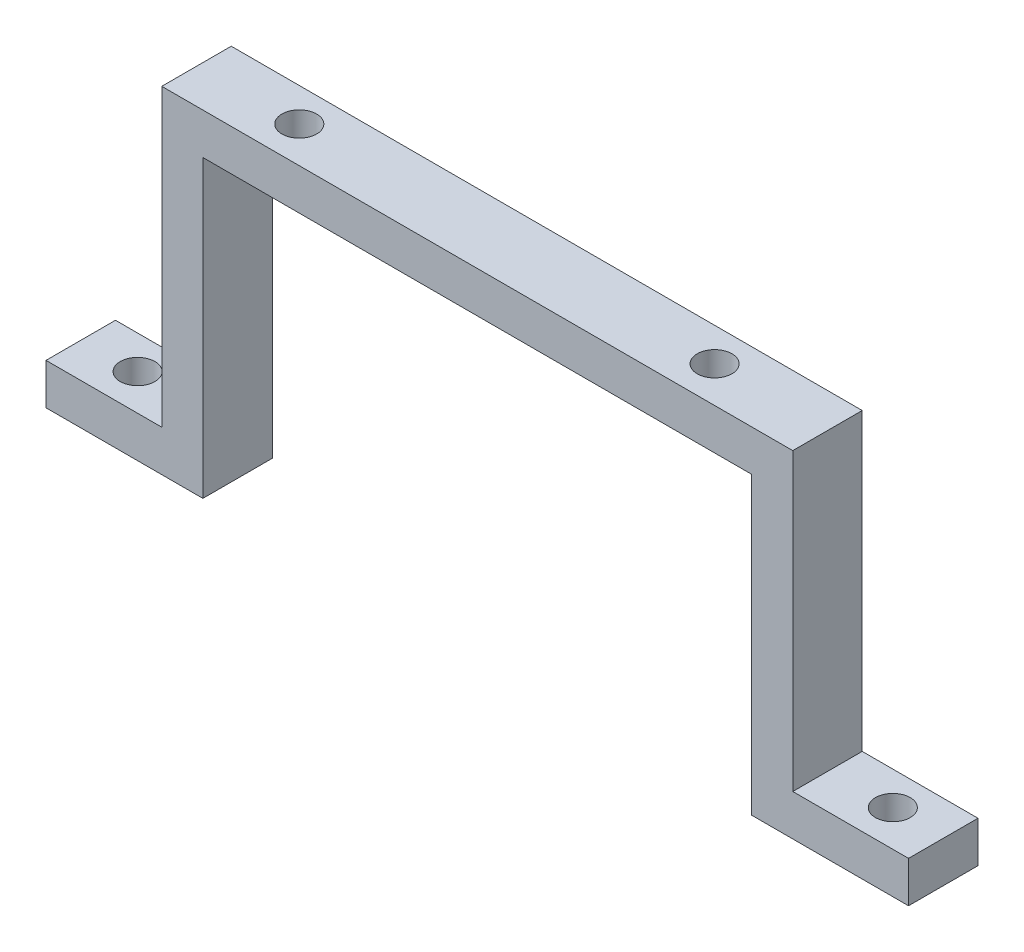
ISO-10303-21;
HEADER;
FILE_DESCRIPTION(('STEP AP214'),'2;1');
FILE_NAME('part.step','',(''),(''),'','','');
FILE_SCHEMA(('AUTOMOTIVE_DESIGN { 1 0 10303 214 1 1 1 1 }'));
ENDSEC;
DATA;
#1=APPLICATION_CONTEXT('core data for automotive mechanical design processes');
#2=APPLICATION_PROTOCOL_DEFINITION('international standard','automotive_design',2000,#1);
#3=PRODUCT_CONTEXT('',#1,'mechanical');
#4=PRODUCT('Part','Part','',(#3));
#5=PRODUCT_RELATED_PRODUCT_CATEGORY('part','',(#4));
#6=PRODUCT_DEFINITION_FORMATION('','',#4);
#7=PRODUCT_DEFINITION_CONTEXT('part definition',#1,'design');
#8=PRODUCT_DEFINITION('design','',#6,#7);
#9=PRODUCT_DEFINITION_SHAPE('','',#8);
#10=(LENGTH_UNIT() NAMED_UNIT(*) SI_UNIT(.MILLI.,.METRE.));
#11=(NAMED_UNIT(*) PLANE_ANGLE_UNIT() SI_UNIT($,.RADIAN.));
#12=(NAMED_UNIT(*) SI_UNIT($,.STERADIAN.) SOLID_ANGLE_UNIT());
#13=UNCERTAINTY_MEASURE_WITH_UNIT(LENGTH_MEASURE(1.E-05),#10,'distance_accuracy_value','');
#14=(GEOMETRIC_REPRESENTATION_CONTEXT(3) GLOBAL_UNCERTAINTY_ASSIGNED_CONTEXT((#13)) GLOBAL_UNIT_ASSIGNED_CONTEXT((#10,
#11,#12)) REPRESENTATION_CONTEXT('',''));
#15=CARTESIAN_POINT('',(0.,0.,0.));
#16=DIRECTION('',(0.,0.,1.));
#17=DIRECTION('',(1.,0.,0.));
#18=AXIS2_PLACEMENT_3D('',#15,#16,#17);
#19=CARTESIAN_POINT('',(52.0672999658622,-3.55008003057952,6.));
#20=DIRECTION('',(0.,1.,0.));
#21=DIRECTION('',(-1.,0.,0.));
#22=AXIS2_PLACEMENT_3D('',#19,#20,#21);
#23=PLANE('',#22);
#24=CARTESIAN_POINT('',(57.5916408370889,-3.55008003057952,2.8809648636639));
#25=DIRECTION('',(0.,1.,0.));
#26=DIRECTION('',(-1.,0.,0.));
#27=AXIS2_PLACEMENT_3D('',#24,#25,#26);
#28=CIRCLE('',#27,1.5);
#29=CARTESIAN_POINT('',(56.0916408370889,-3.55008003057952,2.8809648636639));
#30=VERTEX_POINT('',#29);
#31=EDGE_CURVE('E165',#30,#30,#28,.F.);
#32=ORIENTED_EDGE('',*,*,#31,.F.);
#33=EDGE_LOOP('',(#32));
#34=FACE_BOUND('',#33,.T.);
#35=DIRECTION('',(1.,0.,0.));
#36=VECTOR('',#35,1.);
#37=CARTESIAN_POINT('',(52.0672999658622,-3.55008003057952,0.));
#38=LINE('',#37,#36);
#39=CARTESIAN_POINT('',(48.5172199352827,-3.55008003057952,0.));
#40=VERTEX_POINT('',#39);
#41=CARTESIAN_POINT('',(62.0672999658622,-3.55008003057952,0.));
#42=VERTEX_POINT('',#41);
#43=EDGE_CURVE('E161',#40,#42,#38,.T.);
#44=ORIENTED_EDGE('',*,*,#43,.T.);
#45=DIRECTION('',(0.,0.,-1.));
#46=VECTOR('',#45,1.);
#47=CARTESIAN_POINT('',(62.0672999658622,-3.55008003057952,6.));
#48=LINE('',#47,#46);
#49=CARTESIAN_POINT('',(62.0672999658622,-3.55008003057952,6.));
#50=VERTEX_POINT('',#49);
#51=EDGE_CURVE('E11',#50,#42,#48,.T.);
#52=ORIENTED_EDGE('',*,*,#51,.F.);
#53=DIRECTION('',(1.,0.,0.));
#54=VECTOR('',#53,1.);
#55=CARTESIAN_POINT('',(52.0672999658622,-3.55008003057952,6.));
#56=LINE('',#55,#54);
#57=CARTESIAN_POINT('',(48.5172199352827,-3.55008003057952,6.));
#58=VERTEX_POINT('',#57);
#59=EDGE_CURVE('E109',#58,#50,#56,.T.);
#60=ORIENTED_EDGE('',*,*,#59,.F.);
#61=DIRECTION('',(0.,0.,-1.));
#62=VECTOR('',#61,1.);
#63=CARTESIAN_POINT('',(48.5172199352827,-3.55008003057952,6.));
#64=LINE('',#63,#62);
#65=EDGE_CURVE('E157',#58,#40,#64,.T.);
#66=ORIENTED_EDGE('',*,*,#65,.T.);
#67=EDGE_LOOP('',(#44,#52,#60,#66));
#68=FACE_BOUND('',#67,.T.);
#69=ADVANCED_FACE('F39',(#34,#68),#23,.F.);
#70=CARTESIAN_POINT('',(62.0672999658622,0.,6.));
#71=DIRECTION('',(1.,0.,0.));
#72=DIRECTION('',(0.,0.,-1.));
#73=AXIS2_PLACEMENT_3D('',#70,#71,#72);
#74=PLANE('',#73);
#75=DIRECTION('',(0.,-1.,0.));
#76=VECTOR('',#75,1.);
#77=CARTESIAN_POINT('',(62.0672999658622,0.,0.));
#78=LINE('',#77,#76);
#79=CARTESIAN_POINT('',(62.0672999658622,0.,0.));
#80=VERTEX_POINT('',#79);
#81=EDGE_CURVE('E164',#80,#42,#78,.T.);
#82=ORIENTED_EDGE('',*,*,#81,.F.);
#83=DIRECTION('',(0.,0.,-1.));
#84=VECTOR('',#83,1.);
#85=CARTESIAN_POINT('',(62.0672999658622,0.,6.));
#86=LINE('',#85,#84);
#87=CARTESIAN_POINT('',(62.0672999658622,0.,6.));
#88=VERTEX_POINT('',#87);
#89=EDGE_CURVE('E48',#88,#80,#86,.T.);
#90=ORIENTED_EDGE('',*,*,#89,.F.);
#91=DIRECTION('',(0.,-1.,0.));
#92=VECTOR('',#91,1.);
#93=CARTESIAN_POINT('',(62.0672999658622,0.,6.));
#94=LINE('',#93,#92);
#95=EDGE_CURVE('E230',#88,#50,#94,.T.);
#96=ORIENTED_EDGE('',*,*,#95,.T.);
#97=ORIENTED_EDGE('',*,*,#51,.T.);
#98=EDGE_LOOP('',(#82,#90,#96,#97));
#99=FACE_BOUND('',#98,.T.);
#100=ADVANCED_FACE('F278',(#99),#74,.T.);
#101=CARTESIAN_POINT('',(52.0672999658622,0.,6.));
#102=DIRECTION('',(0.,1.,0.));
#103=DIRECTION('',(-1.,0.,0.));
#104=AXIS2_PLACEMENT_3D('',#101,#102,#103);
#105=PLANE('',#104);
#106=CARTESIAN_POINT('',(57.5916408370889,0.,2.8809648636639));
#107=DIRECTION('',(0.,1.,0.));
#108=DIRECTION('',(-1.,0.,0.));
#109=AXIS2_PLACEMENT_3D('',#106,#107,#108);
#110=CIRCLE('',#109,1.5);
#111=CARTESIAN_POINT('',(56.0916408370889,0.,2.8809648636639));
#112=VERTEX_POINT('',#111);
#113=EDGE_CURVE('E42',#112,#112,#110,.F.);
#114=ORIENTED_EDGE('',*,*,#113,.T.);
#115=EDGE_LOOP('',(#114));
#116=FACE_BOUND('',#115,.T.);
#117=DIRECTION('',(1.,0.,0.));
#118=VECTOR('',#117,1.);
#119=CARTESIAN_POINT('',(52.0672999658622,0.,0.));
#120=LINE('',#119,#118);
#121=CARTESIAN_POINT('',(52.0672999658622,0.,0.));
#122=VERTEX_POINT('',#121);
#123=EDGE_CURVE('E168',#122,#80,#120,.T.);
#124=ORIENTED_EDGE('',*,*,#123,.F.);
#125=DIRECTION('',(0.,0.,-1.));
#126=VECTOR('',#125,1.);
#127=CARTESIAN_POINT('',(52.0672999658622,0.,6.));
#128=LINE('',#127,#126);
#129=CARTESIAN_POINT('',(52.0672999658622,0.,6.));
#130=VERTEX_POINT('',#129);
#131=EDGE_CURVE('E204',#130,#122,#128,.T.);
#132=ORIENTED_EDGE('',*,*,#131,.F.);
#133=DIRECTION('',(1.,0.,0.));
#134=VECTOR('',#133,1.);
#135=CARTESIAN_POINT('',(52.0672999658622,0.,6.));
#136=LINE('',#135,#134);
#137=EDGE_CURVE('E233',#130,#88,#136,.T.);
#138=ORIENTED_EDGE('',*,*,#137,.T.);
#139=ORIENTED_EDGE('',*,*,#89,.T.);
#140=EDGE_LOOP('',(#124,#132,#138,#139));
#141=FACE_BOUND('',#140,.T.);
#142=ADVANCED_FACE('F285',(#116,#141),#105,.T.);
#143=CARTESIAN_POINT('',(52.0672999658622,25.5,6.));
#144=DIRECTION('',(1.,0.,0.));
#145=DIRECTION('',(0.,0.,-1.));
#146=AXIS2_PLACEMENT_3D('',#143,#144,#145);
#147=PLANE('',#146);
#148=DIRECTION('',(0.,-1.,0.));
#149=VECTOR('',#148,1.);
#150=CARTESIAN_POINT('',(52.0672999658622,25.5,0.));
#151=LINE('',#150,#149);
#152=CARTESIAN_POINT('',(52.0672999658622,25.5,0.));
#153=VERTEX_POINT('',#152);
#154=EDGE_CURVE('E171',#153,#122,#151,.T.);
#155=ORIENTED_EDGE('',*,*,#154,.F.);
#156=DIRECTION('',(0.,0.,-1.));
#157=VECTOR('',#156,1.);
#158=CARTESIAN_POINT('',(52.0672999658622,25.5,6.));
#159=LINE('',#158,#157);
#160=CARTESIAN_POINT('',(52.0672999658622,25.5,6.));
#161=VERTEX_POINT('',#160);
#162=EDGE_CURVE('E202',#161,#153,#159,.T.);
#163=ORIENTED_EDGE('',*,*,#162,.F.);
#164=DIRECTION('',(0.,-1.,0.));
#165=VECTOR('',#164,1.);
#166=CARTESIAN_POINT('',(52.0672999658622,25.5,6.));
#167=LINE('',#166,#165);
#168=EDGE_CURVE('E236',#161,#130,#167,.T.);
#169=ORIENTED_EDGE('',*,*,#168,.T.);
#170=ORIENTED_EDGE('',*,*,#131,.T.);
#171=EDGE_LOOP('',(#155,#163,#169,#170));
#172=FACE_BOUND('',#171,.T.);
#173=ADVANCED_FACE('F296',(#172),#147,.T.);
#174=CARTESIAN_POINT('',(-2.43270003413782,25.5,6.));
#175=DIRECTION('',(0.,1.,0.));
#176=DIRECTION('',(0.,0.,1.));
#177=AXIS2_PLACEMENT_3D('',#174,#175,#176);
#178=PLANE('',#177);
#179=CARTESIAN_POINT('',(6.32717545497642,25.5,2.8809648636639));
#180=DIRECTION('',(0.,1.,0.));
#181=DIRECTION('',(0.,0.,1.));
#182=AXIS2_PLACEMENT_3D('',#179,#180,#181);
#183=CIRCLE('',#182,1.5);
#184=CARTESIAN_POINT('',(6.32717545497642,25.5,4.3809648636639));
#185=VERTEX_POINT('',#184);
#186=EDGE_CURVE('E213',#185,#185,#183,.F.);
#187=ORIENTED_EDGE('',*,*,#186,.T.);
#188=EDGE_LOOP('',(#187));
#189=FACE_BOUND('',#188,.T.);
#190=CARTESIAN_POINT('',(42.1964298709437,25.5,2.8809648636639));
#191=DIRECTION('',(0.,1.,0.));
#192=DIRECTION('',(0.,0.,1.));
#193=AXIS2_PLACEMENT_3D('',#190,#191,#192);
#194=CIRCLE('',#193,1.5);
#195=CARTESIAN_POINT('',(42.1964298709437,25.5,4.38096486366391));
#196=VERTEX_POINT('',#195);
#197=EDGE_CURVE('E210',#196,#196,#194,.F.);
#198=ORIENTED_EDGE('',*,*,#197,.T.);
#199=EDGE_LOOP('',(#198));
#200=FACE_BOUND('',#199,.T.);
#201=DIRECTION('',(1.,0.,0.));
#202=VECTOR('',#201,1.);
#203=CARTESIAN_POINT('',(-2.43270003413782,25.5,0.));
#204=LINE('',#203,#202);
#205=CARTESIAN_POINT('',(-2.43270003413782,25.5,0.));
#206=VERTEX_POINT('',#205);
#207=EDGE_CURVE('E174',#206,#153,#204,.T.);
#208=ORIENTED_EDGE('',*,*,#207,.F.);
#209=DIRECTION('',(0.,0.,-1.));
#210=VECTOR('',#209,1.);
#211=CARTESIAN_POINT('',(-2.43270003413782,25.5,6.));
#212=LINE('',#211,#210);
#213=CARTESIAN_POINT('',(-2.43270003413782,25.5,6.));
#214=VERTEX_POINT('',#213);
#215=EDGE_CURVE('E200',#214,#206,#212,.T.);
#216=ORIENTED_EDGE('',*,*,#215,.F.);
#217=DIRECTION('',(1.,0.,0.));
#218=VECTOR('',#217,1.);
#219=CARTESIAN_POINT('',(-2.43270003413782,25.5,6.));
#220=LINE('',#219,#218);
#221=EDGE_CURVE('E239',#214,#161,#220,.T.);
#222=ORIENTED_EDGE('',*,*,#221,.T.);
#223=ORIENTED_EDGE('',*,*,#162,.T.);
#224=EDGE_LOOP('',(#208,#216,#222,#223));
#225=FACE_BOUND('',#224,.T.);
#226=ADVANCED_FACE('F299',(#189,#200,#225),#178,.T.);
#227=CARTESIAN_POINT('',(-2.43270003413782,0.,6.));
#228=DIRECTION('',(-1.,0.,0.));
#229=DIRECTION('',(0.,0.,1.));
#230=AXIS2_PLACEMENT_3D('',#227,#228,#229);
#231=PLANE('',#230);
#232=DIRECTION('',(0.,1.,0.));
#233=VECTOR('',#232,1.);
#234=CARTESIAN_POINT('',(-2.43270003413782,0.,0.));
#235=LINE('',#234,#233);
#236=CARTESIAN_POINT('',(-2.43270003413782,0.,0.));
#237=VERTEX_POINT('',#236);
#238=EDGE_CURVE('E177',#237,#206,#235,.T.);
#239=ORIENTED_EDGE('',*,*,#238,.F.);
#240=DIRECTION('',(0.,0.,-1.));
#241=VECTOR('',#240,1.);
#242=CARTESIAN_POINT('',(-2.43270003413782,0.,6.));
#243=LINE('',#242,#241);
#244=CARTESIAN_POINT('',(-2.43270003413782,0.,6.));
#245=VERTEX_POINT('',#244);
#246=EDGE_CURVE('E198',#245,#237,#243,.T.);
#247=ORIENTED_EDGE('',*,*,#246,.F.);
#248=DIRECTION('',(0.,1.,0.));
#249=VECTOR('',#248,1.);
#250=CARTESIAN_POINT('',(-2.43270003413782,0.,6.));
#251=LINE('',#250,#249);
#252=EDGE_CURVE('E242',#245,#214,#251,.T.);
#253=ORIENTED_EDGE('',*,*,#252,.T.);
#254=ORIENTED_EDGE('',*,*,#215,.T.);
#255=EDGE_LOOP('',(#239,#247,#253,#254));
#256=FACE_BOUND('',#255,.T.);
#257=ADVANCED_FACE('F301',(#256),#231,.T.);
#258=CARTESIAN_POINT('',(-12.4327000341378,0.,6.));
#259=DIRECTION('',(0.,1.,0.));
#260=DIRECTION('',(0.,0.,1.));
#261=AXIS2_PLACEMENT_3D('',#258,#259,#260);
#262=PLANE('',#261);
#263=CARTESIAN_POINT('',(-7.63961387513471,0.,2.8809648636639));
#264=DIRECTION('',(0.,1.,0.));
#265=DIRECTION('',(0.,0.,1.));
#266=AXIS2_PLACEMENT_3D('',#263,#264,#265);
#267=CIRCLE('',#266,1.5);
#268=CARTESIAN_POINT('',(-7.63961387513471,0.,4.3809648636639));
#269=VERTEX_POINT('',#268);
#270=EDGE_CURVE('E216',#269,#269,#267,.F.);
#271=ORIENTED_EDGE('',*,*,#270,.T.);
#272=EDGE_LOOP('',(#271));
#273=FACE_BOUND('',#272,.T.);
#274=DIRECTION('',(1.,0.,0.));
#275=VECTOR('',#274,1.);
#276=CARTESIAN_POINT('',(-12.4327000341378,0.,0.));
#277=LINE('',#276,#275);
#278=CARTESIAN_POINT('',(-12.4327000341378,0.,0.));
#279=VERTEX_POINT('',#278);
#280=EDGE_CURVE('E180',#279,#237,#277,.T.);
#281=ORIENTED_EDGE('',*,*,#280,.F.);
#282=DIRECTION('',(0.,0.,-1.));
#283=VECTOR('',#282,1.);
#284=CARTESIAN_POINT('',(-12.4327000341378,0.,6.));
#285=LINE('',#284,#283);
#286=CARTESIAN_POINT('',(-12.4327000341378,0.,6.));
#287=VERTEX_POINT('',#286);
#288=EDGE_CURVE('E196',#287,#279,#285,.T.);
#289=ORIENTED_EDGE('',*,*,#288,.F.);
#290=DIRECTION('',(1.,0.,0.));
#291=VECTOR('',#290,1.);
#292=CARTESIAN_POINT('',(-12.4327000341378,0.,6.));
#293=LINE('',#292,#291);
#294=EDGE_CURVE('E245',#287,#245,#293,.T.);
#295=ORIENTED_EDGE('',*,*,#294,.T.);
#296=ORIENTED_EDGE('',*,*,#246,.T.);
#297=EDGE_LOOP('',(#281,#289,#295,#296));
#298=FACE_BOUND('',#297,.T.);
#299=ADVANCED_FACE('F258',(#273,#298),#262,.T.);
#300=CARTESIAN_POINT('',(-12.4327000341378,-3.55008003057952,6.));
#301=DIRECTION('',(-1.,0.,0.));
#302=DIRECTION('',(0.,0.,1.));
#303=AXIS2_PLACEMENT_3D('',#300,#301,#302);
#304=PLANE('',#303);
#305=DIRECTION('',(0.,1.,0.));
#306=VECTOR('',#305,1.);
#307=CARTESIAN_POINT('',(-12.4327000341378,-3.55008003057952,0.));
#308=LINE('',#307,#306);
#309=CARTESIAN_POINT('',(-12.4327000341378,-3.55008003057952,0.));
#310=VERTEX_POINT('',#309);
#311=EDGE_CURVE('E183',#310,#279,#308,.T.);
#312=ORIENTED_EDGE('',*,*,#311,.F.);
#313=DIRECTION('',(0.,0.,-1.));
#314=VECTOR('',#313,1.);
#315=CARTESIAN_POINT('',(-12.4327000341378,-3.55008003057952,6.));
#316=LINE('',#315,#314);
#317=CARTESIAN_POINT('',(-12.4327000341378,-3.55008003057952,6.));
#318=VERTEX_POINT('',#317);
#319=EDGE_CURVE('E194',#318,#310,#316,.T.);
#320=ORIENTED_EDGE('',*,*,#319,.F.);
#321=DIRECTION('',(0.,1.,0.));
#322=VECTOR('',#321,1.);
#323=CARTESIAN_POINT('',(-12.4327000341378,-3.55008003057952,6.));
#324=LINE('',#323,#322);
#325=EDGE_CURVE('E248',#318,#287,#324,.T.);
#326=ORIENTED_EDGE('',*,*,#325,.T.);
#327=ORIENTED_EDGE('',*,*,#288,.T.);
#328=EDGE_LOOP('',(#312,#320,#326,#327));
#329=FACE_BOUND('',#328,.T.);
#330=ADVANCED_FACE('F252',(#329),#304,.T.);
#331=CARTESIAN_POINT('',(-12.4327000341378,-3.55008003057952,6.));
#332=DIRECTION('',(0.,1.,0.));
#333=DIRECTION('',(0.,0.,1.));
#334=AXIS2_PLACEMENT_3D('',#331,#332,#333);
#335=PLANE('',#334);
#336=CARTESIAN_POINT('',(-7.63961387513471,-3.55008003057952,2.8809648636639));
#337=DIRECTION('',(0.,1.,0.));
#338=DIRECTION('',(0.,0.,1.));
#339=AXIS2_PLACEMENT_3D('',#336,#337,#338);
#340=CIRCLE('',#339,1.5);
#341=CARTESIAN_POINT('',(-7.63961387513471,-3.55008003057952,4.3809648636639));
#342=VERTEX_POINT('',#341);
#343=EDGE_CURVE('E214',#342,#342,#340,.F.);
#344=ORIENTED_EDGE('',*,*,#343,.F.);
#345=EDGE_LOOP('',(#344));
#346=FACE_BOUND('',#345,.T.);
#347=DIRECTION('',(1.,0.,0.));
#348=VECTOR('',#347,1.);
#349=CARTESIAN_POINT('',(-12.4327000341378,-3.55008003057952,0.));
#350=LINE('',#349,#348);
#351=CARTESIAN_POINT('',(1.1173799964417,-3.55008003057952,0.));
#352=VERTEX_POINT('',#351);
#353=EDGE_CURVE('E186',#310,#352,#350,.T.);
#354=ORIENTED_EDGE('',*,*,#353,.T.);
#355=DIRECTION('',(0.,0.,-1.));
#356=VECTOR('',#355,1.);
#357=CARTESIAN_POINT('',(1.1173799964417,-3.55008003057952,6.));
#358=LINE('',#357,#356);
#359=CARTESIAN_POINT('',(1.1173799964417,-3.55008003057952,6.));
#360=VERTEX_POINT('',#359);
#361=EDGE_CURVE('E152',#360,#352,#358,.T.);
#362=ORIENTED_EDGE('',*,*,#361,.F.);
#363=DIRECTION('',(1.,0.,0.));
#364=VECTOR('',#363,1.);
#365=CARTESIAN_POINT('',(-12.4327000341378,-3.55008003057952,6.));
#366=LINE('',#365,#364);
#367=EDGE_CURVE('E143',#318,#360,#366,.T.);
#368=ORIENTED_EDGE('',*,*,#367,.F.);
#369=ORIENTED_EDGE('',*,*,#319,.T.);
#370=EDGE_LOOP('',(#354,#362,#368,#369));
#371=FACE_BOUND('',#370,.T.);
#372=ADVANCED_FACE('F265',(#346,#371),#335,.F.);
#373=CARTESIAN_POINT('',(1.1173799964417,0.,6.));
#374=DIRECTION('',(-1.,0.,0.));
#375=DIRECTION('',(0.,0.,1.));
#376=AXIS2_PLACEMENT_3D('',#373,#374,#375);
#377=PLANE('',#376);
#378=DIRECTION('',(0.,1.,0.));
#379=VECTOR('',#378,1.);
#380=CARTESIAN_POINT('',(1.1173799964417,0.,0.));
#381=LINE('',#380,#379);
#382=CARTESIAN_POINT('',(1.1173799964417,21.9499199694205,0.));
#383=VERTEX_POINT('',#382);
#384=EDGE_CURVE('E151',#352,#383,#381,.T.);
#385=ORIENTED_EDGE('',*,*,#384,.T.);
#386=DIRECTION('',(0.,0.,-1.));
#387=VECTOR('',#386,1.);
#388=CARTESIAN_POINT('',(1.1173799964417,21.9499199694205,6.));
#389=LINE('',#388,#387);
#390=CARTESIAN_POINT('',(1.1173799964417,21.9499199694205,6.));
#391=VERTEX_POINT('',#390);
#392=EDGE_CURVE('E148',#391,#383,#389,.T.);
#393=ORIENTED_EDGE('',*,*,#392,.F.);
#394=DIRECTION('',(0.,1.,0.));
#395=VECTOR('',#394,1.);
#396=CARTESIAN_POINT('',(1.1173799964417,0.,6.));
#397=LINE('',#396,#395);
#398=EDGE_CURVE('E136',#360,#391,#397,.T.);
#399=ORIENTED_EDGE('',*,*,#398,.F.);
#400=ORIENTED_EDGE('',*,*,#361,.T.);
#401=EDGE_LOOP('',(#385,#393,#399,#400));
#402=FACE_BOUND('',#401,.T.);
#403=ADVANCED_FACE('F149',(#402),#377,.F.);
#404=CARTESIAN_POINT('',(-2.43270003413782,21.9499199694205,6.));
#405=DIRECTION('',(0.,1.,0.));
#406=DIRECTION('',(0.,0.,1.));
#407=AXIS2_PLACEMENT_3D('',#404,#405,#406);
#408=PLANE('',#407);
#409=CARTESIAN_POINT('',(6.32717545497642,21.9499199694205,2.8809648636639));
#410=DIRECTION('',(0.,1.,0.));
#411=DIRECTION('',(0.,0.,1.));
#412=AXIS2_PLACEMENT_3D('',#409,#410,#411);
#413=CIRCLE('',#412,1.5);
#414=CARTESIAN_POINT('',(6.32717545497642,21.9499199694205,4.3809648636639));
#415=VERTEX_POINT('',#414);
#416=EDGE_CURVE('E211',#415,#415,#413,.F.);
#417=ORIENTED_EDGE('',*,*,#416,.F.);
#418=EDGE_LOOP('',(#417));
#419=FACE_BOUND('',#418,.T.);
#420=CARTESIAN_POINT('',(42.1964298709437,21.9499199694205,2.8809648636639));
#421=DIRECTION('',(0.,1.,0.));
#422=DIRECTION('',(0.,0.,1.));
#423=AXIS2_PLACEMENT_3D('',#420,#421,#422);
#424=CIRCLE('',#423,1.5);
#425=CARTESIAN_POINT('',(42.1964298709437,21.9499199694205,4.38096486366391));
#426=VERTEX_POINT('',#425);
#427=EDGE_CURVE('E207',#426,#426,#424,.F.);
#428=ORIENTED_EDGE('',*,*,#427,.F.);
#429=EDGE_LOOP('',(#428));
#430=FACE_BOUND('',#429,.T.);
#431=DIRECTION('',(1.,0.,0.));
#432=VECTOR('',#431,1.);
#433=CARTESIAN_POINT('',(-2.43270003413782,21.9499199694205,0.));
#434=LINE('',#433,#432);
#435=CARTESIAN_POINT('',(48.5172199352827,21.9499199694205,0.));
#436=VERTEX_POINT('',#435);
#437=EDGE_CURVE('E97',#383,#436,#434,.T.);
#438=ORIENTED_EDGE('',*,*,#437,.T.);
#439=DIRECTION('',(0.,0.,-1.));
#440=VECTOR('',#439,1.);
#441=CARTESIAN_POINT('',(48.5172199352827,21.9499199694205,6.));
#442=LINE('',#441,#440);
#443=CARTESIAN_POINT('',(48.5172199352827,21.9499199694205,6.));
#444=VERTEX_POINT('',#443);
#445=EDGE_CURVE('E153',#444,#436,#442,.T.);
#446=ORIENTED_EDGE('',*,*,#445,.F.);
#447=DIRECTION('',(1.,0.,0.));
#448=VECTOR('',#447,1.);
#449=CARTESIAN_POINT('',(-2.43270003413782,21.9499199694205,6.));
#450=LINE('',#449,#448);
#451=EDGE_CURVE('E140',#391,#444,#450,.T.);
#452=ORIENTED_EDGE('',*,*,#451,.F.);
#453=ORIENTED_EDGE('',*,*,#392,.T.);
#454=EDGE_LOOP('',(#438,#446,#452,#453));
#455=FACE_BOUND('',#454,.T.);
#456=ADVANCED_FACE('F155',(#419,#430,#455),#408,.F.);
#457=CARTESIAN_POINT('',(48.5172199352827,25.5,6.));
#458=DIRECTION('',(1.,0.,0.));
#459=DIRECTION('',(0.,0.,-1.));
#460=AXIS2_PLACEMENT_3D('',#457,#458,#459);
#461=PLANE('',#460);
#462=DIRECTION('',(0.,1.,0.));
#463=VECTOR('',#462,1.);
#464=CARTESIAN_POINT('',(48.5172199352827,25.5,0.));
#465=LINE('',#464,#463);
#466=EDGE_CURVE('E103',#436,#40,#465,.F.);
#467=ORIENTED_EDGE('',*,*,#466,.T.);
#468=ORIENTED_EDGE('',*,*,#65,.F.);
#469=DIRECTION('',(0.,1.,0.));
#470=VECTOR('',#469,1.);
#471=CARTESIAN_POINT('',(48.5172199352827,25.5,6.));
#472=LINE('',#471,#470);
#473=EDGE_CURVE('E57',#444,#58,#472,.F.);
#474=ORIENTED_EDGE('',*,*,#473,.F.);
#475=ORIENTED_EDGE('',*,*,#445,.T.);
#476=EDGE_LOOP('',(#467,#468,#474,#475));
#477=FACE_BOUND('',#476,.T.);
#478=ADVANCED_FACE('F336',(#477),#461,.F.);
#479=CARTESIAN_POINT('',(0.,0.,6.));
#480=DIRECTION('',(0.,0.,-1.));
#481=DIRECTION('',(-1.,0.,0.));
#482=AXIS2_PLACEMENT_3D('',#479,#480,#481);
#483=PLANE('',#482);
#484=ORIENTED_EDGE('',*,*,#59,.T.);
#485=ORIENTED_EDGE('',*,*,#95,.F.);
#486=ORIENTED_EDGE('',*,*,#137,.F.);
#487=ORIENTED_EDGE('',*,*,#168,.F.);
#488=ORIENTED_EDGE('',*,*,#221,.F.);
#489=ORIENTED_EDGE('',*,*,#252,.F.);
#490=ORIENTED_EDGE('',*,*,#294,.F.);
#491=ORIENTED_EDGE('',*,*,#325,.F.);
#492=ORIENTED_EDGE('',*,*,#367,.T.);
#493=ORIENTED_EDGE('',*,*,#398,.T.);
#494=ORIENTED_EDGE('',*,*,#451,.T.);
#495=ORIENTED_EDGE('',*,*,#473,.T.);
#496=EDGE_LOOP('',(#484,#485,#486,#487,#488,#489,#490,#491,#492,#493,#494,#495));
#497=FACE_BOUND('',#496,.T.);
#498=ADVANCED_FACE('F138',(#497),#483,.F.);
#499=CARTESIAN_POINT('',(0.,0.,0.));
#500=DIRECTION('',(0.,0.,-1.));
#501=DIRECTION('',(-1.,0.,0.));
#502=AXIS2_PLACEMENT_3D('',#499,#500,#501);
#503=PLANE('',#502);
#504=ORIENTED_EDGE('',*,*,#43,.F.);
#505=ORIENTED_EDGE('',*,*,#466,.F.);
#506=ORIENTED_EDGE('',*,*,#437,.F.);
#507=ORIENTED_EDGE('',*,*,#384,.F.);
#508=ORIENTED_EDGE('',*,*,#353,.F.);
#509=ORIENTED_EDGE('',*,*,#311,.T.);
#510=ORIENTED_EDGE('',*,*,#280,.T.);
#511=ORIENTED_EDGE('',*,*,#238,.T.);
#512=ORIENTED_EDGE('',*,*,#207,.T.);
#513=ORIENTED_EDGE('',*,*,#154,.T.);
#514=ORIENTED_EDGE('',*,*,#123,.T.);
#515=ORIENTED_EDGE('',*,*,#81,.T.);
#516=EDGE_LOOP('',(#504,#505,#506,#507,#508,#509,#510,#511,#512,#513,#514,#515));
#517=FACE_BOUND('',#516,.T.);
#518=ADVANCED_FACE('F263',(#517),#503,.T.);
#519=CARTESIAN_POINT('',(42.1964298709437,41.,2.8809648636639));
#520=DIRECTION('',(0.,-1.,0.));
#521=DIRECTION('',(0.,0.,-1.));
#522=AXIS2_PLACEMENT_3D('',#519,#520,#521);
#523=CYLINDRICAL_SURFACE('',#522,1.5);
#524=ORIENTED_EDGE('',*,*,#197,.F.);
#525=EDGE_LOOP('',(#524));
#526=FACE_BOUND('',#525,.T.);
#527=ORIENTED_EDGE('',*,*,#427,.T.);
#528=EDGE_LOOP('',(#527));
#529=FACE_BOUND('',#528,.T.);
#530=ADVANCED_FACE('F332',(#526,#529),#523,.F.);
#531=CARTESIAN_POINT('',(6.32717545497642,41.,2.8809648636639));
#532=DIRECTION('',(0.,-1.,0.));
#533=DIRECTION('',(0.,0.,-1.));
#534=AXIS2_PLACEMENT_3D('',#531,#532,#533);
#535=CYLINDRICAL_SURFACE('',#534,1.5);
#536=ORIENTED_EDGE('',*,*,#186,.F.);
#537=EDGE_LOOP('',(#536));
#538=FACE_BOUND('',#537,.T.);
#539=ORIENTED_EDGE('',*,*,#416,.T.);
#540=EDGE_LOOP('',(#539));
#541=FACE_BOUND('',#540,.T.);
#542=ADVANCED_FACE('F327',(#538,#541),#535,.F.);
#543=CARTESIAN_POINT('',(-7.63961387513471,41.,2.8809648636639));
#544=DIRECTION('',(0.,-1.,0.));
#545=DIRECTION('',(0.,0.,-1.));
#546=AXIS2_PLACEMENT_3D('',#543,#544,#545);
#547=CYLINDRICAL_SURFACE('',#546,1.5);
#548=ORIENTED_EDGE('',*,*,#270,.F.);
#549=EDGE_LOOP('',(#548));
#550=FACE_BOUND('',#549,.T.);
#551=ORIENTED_EDGE('',*,*,#343,.T.);
#552=EDGE_LOOP('',(#551));
#553=FACE_BOUND('',#552,.T.);
#554=ADVANCED_FACE('F322',(#550,#553),#547,.F.);
#555=CARTESIAN_POINT('',(57.5916408370889,41.,2.8809648636639));
#556=DIRECTION('',(0.,-1.,0.));
#557=DIRECTION('',(0.,0.,-1.));
#558=AXIS2_PLACEMENT_3D('',#555,#556,#557);
#559=CYLINDRICAL_SURFACE('',#558,1.5);
#560=ORIENTED_EDGE('',*,*,#113,.F.);
#561=EDGE_LOOP('',(#560));
#562=FACE_BOUND('',#561,.T.);
#563=ORIENTED_EDGE('',*,*,#31,.T.);
#564=EDGE_LOOP('',(#563));
#565=FACE_BOUND('',#564,.T.);
#566=ADVANCED_FACE('F319',(#562,#565),#559,.F.);
#567=CLOSED_SHELL('',(#69,#100,#142,#173,#226,#257,#299,#330,#372,#403,#456,#478,#498,#518,#530,
#542,#554,#566));
#568=MANIFOLD_SOLID_BREP('B2',#567);
#569=ADVANCED_BREP_SHAPE_REPRESENTATION('',(#18,#568),#14);
#570=SHAPE_DEFINITION_REPRESENTATION(#9,#569);
ENDSEC;
END-ISO-10303-21;
